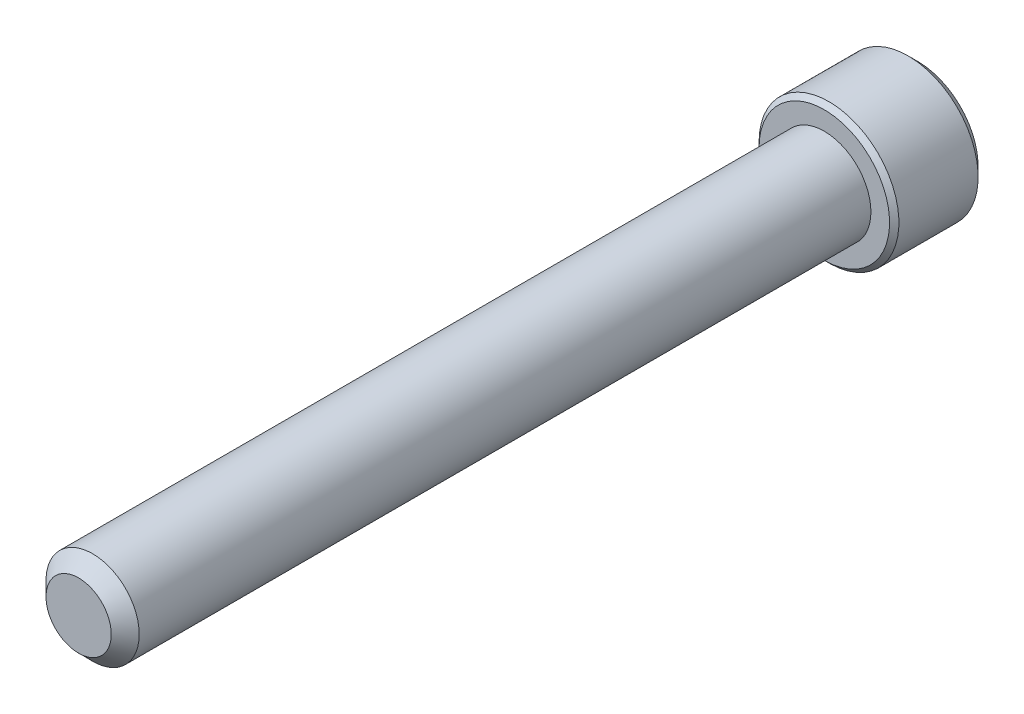
ISO-10303-21;
HEADER;
FILE_DESCRIPTION(('STEP AP214'),'2;1');
FILE_NAME('part.step','',(''),(''),'','','');
FILE_SCHEMA(('AUTOMOTIVE_DESIGN { 1 0 10303 214 1 1 1 1 }'));
ENDSEC;
DATA;
#1=APPLICATION_CONTEXT('core data for automotive mechanical design processes');
#2=APPLICATION_PROTOCOL_DEFINITION('international standard','automotive_design',2000,#1);
#3=PRODUCT_CONTEXT('',#1,'mechanical');
#4=PRODUCT('Part','Part','',(#3));
#5=PRODUCT_RELATED_PRODUCT_CATEGORY('part','',(#4));
#6=PRODUCT_DEFINITION_FORMATION('','',#4);
#7=PRODUCT_DEFINITION_CONTEXT('part definition',#1,'design');
#8=PRODUCT_DEFINITION('design','',#6,#7);
#9=PRODUCT_DEFINITION_SHAPE('','',#8);
#10=(LENGTH_UNIT() NAMED_UNIT(*) SI_UNIT(.MILLI.,.METRE.));
#11=(NAMED_UNIT(*) PLANE_ANGLE_UNIT() SI_UNIT($,.RADIAN.));
#12=(NAMED_UNIT(*) SI_UNIT($,.STERADIAN.) SOLID_ANGLE_UNIT());
#13=UNCERTAINTY_MEASURE_WITH_UNIT(LENGTH_MEASURE(1.E-05),#10,'distance_accuracy_value','');
#14=(GEOMETRIC_REPRESENTATION_CONTEXT(3) GLOBAL_UNCERTAINTY_ASSIGNED_CONTEXT((#13)) GLOBAL_UNIT_ASSIGNED_CONTEXT((#10,
#11,#12)) REPRESENTATION_CONTEXT('',''));
#15=CARTESIAN_POINT('',(0.,0.,0.));
#16=DIRECTION('',(0.,0.,1.));
#17=DIRECTION('',(1.,0.,0.));
#18=AXIS2_PLACEMENT_3D('',#15,#16,#17);
#19=CARTESIAN_POINT('',(0.,0.,-50.8));
#20=DIRECTION('',(0.,0.,1.));
#21=DIRECTION('',(1.,0.,0.));
#22=AXIS2_PLACEMENT_3D('',#19,#20,#21);
#23=CYLINDRICAL_SURFACE('',#22,3.175);
#24=CARTESIAN_POINT('',(0.,0.,-50.8));
#25=DIRECTION('',(0.,0.,-1.));
#26=DIRECTION('',(-1.,0.,0.));
#27=AXIS2_PLACEMENT_3D('',#24,#25,#26);
#28=CIRCLE('',#27,3.175);
#29=CARTESIAN_POINT('',(-3.175,0.,-50.8));
#30=VERTEX_POINT('',#29);
#31=EDGE_CURVE('E210',#30,#30,#28,.F.);
#32=ORIENTED_EDGE('',*,*,#31,.T.);
#33=EDGE_LOOP('',(#32));
#34=FACE_BOUND('',#33,.T.);
#35=CARTESIAN_POINT('',(0.,0.,-0.952499999999995));
#36=DIRECTION('',(0.,0.,1.));
#37=DIRECTION('',(1.,0.,0.));
#38=AXIS2_PLACEMENT_3D('',#35,#36,#37);
#39=CIRCLE('',#38,3.175);
#40=CARTESIAN_POINT('',(3.175,0.,-0.952499999999995));
#41=VERTEX_POINT('',#40);
#42=EDGE_CURVE('E106',#41,#41,#39,.F.);
#43=ORIENTED_EDGE('',*,*,#42,.T.);
#44=EDGE_LOOP('',(#43));
#45=FACE_BOUND('',#44,.T.);
#46=ADVANCED_FACE('F32',(#34,#45),#23,.T.);
#47=CARTESIAN_POINT('',(0.,0.,0.));
#48=DIRECTION('',(0.,0.,1.));
#49=DIRECTION('',(1.,0.,0.));
#50=AXIS2_PLACEMENT_3D('',#47,#48,#49);
#51=PLANE('',#50);
#52=CARTESIAN_POINT('',(0.,0.,0.));
#53=DIRECTION('',(0.,0.,1.));
#54=DIRECTION('',(1.,0.,0.));
#55=AXIS2_PLACEMENT_3D('',#52,#53,#54);
#56=CIRCLE('',#55,2.2225);
#57=CARTESIAN_POINT('',(2.2225,0.,0.));
#58=VERTEX_POINT('',#57);
#59=EDGE_CURVE('E209',#58,#58,#56,.T.);
#60=ORIENTED_EDGE('',*,*,#59,.T.);
#61=EDGE_LOOP('',(#60));
#62=FACE_BOUND('',#61,.T.);
#63=ADVANCED_FACE('F186',(#62),#51,.T.);
#64=CARTESIAN_POINT('',(0.,0.,0.));
#65=DIRECTION('',(0.,0.,-1.));
#66=DIRECTION('',(-1.,0.,0.));
#67=AXIS2_PLACEMENT_3D('',#64,#65,#66);
#68=CONICAL_SURFACE('',#67,2.2225,0.78539816339745);
#69=ORIENTED_EDGE('',*,*,#42,.F.);
#70=EDGE_LOOP('',(#69));
#71=FACE_BOUND('',#70,.T.);
#72=ORIENTED_EDGE('',*,*,#59,.F.);
#73=EDGE_LOOP('',(#72));
#74=FACE_BOUND('',#73,.T.);
#75=ADVANCED_FACE('F192',(#71,#74),#68,.T.);
#76=CARTESIAN_POINT('',(0.,0.,-57.15));
#77=DIRECTION('',(0.,0.,1.));
#78=DIRECTION('',(1.,0.,0.));
#79=AXIS2_PLACEMENT_3D('',#76,#77,#78);
#80=CYLINDRICAL_SURFACE('',#79,4.7625);
#81=CARTESIAN_POINT('',(0.,0.,-51.1175));
#82=DIRECTION('',(0.,0.,-1.));
#83=DIRECTION('',(-1.,0.,0.));
#84=AXIS2_PLACEMENT_3D('',#81,#82,#83);
#85=CIRCLE('',#84,4.7625);
#86=CARTESIAN_POINT('',(-4.7625,0.,-51.1175));
#87=VERTEX_POINT('',#86);
#88=EDGE_CURVE('E40',#87,#87,#85,.T.);
#89=ORIENTED_EDGE('',*,*,#88,.T.);
#90=EDGE_LOOP('',(#89));
#91=FACE_BOUND('',#90,.T.);
#92=CARTESIAN_POINT('',(0.,0.,-56.515));
#93=DIRECTION('',(0.,0.,-1.));
#94=DIRECTION('',(-1.,0.,0.));
#95=AXIS2_PLACEMENT_3D('',#92,#93,#94);
#96=CIRCLE('',#95,4.7625);
#97=CARTESIAN_POINT('',(-4.7625,0.,-56.515));
#98=VERTEX_POINT('',#97);
#99=EDGE_CURVE('E169',#98,#98,#96,.F.);
#100=ORIENTED_EDGE('',*,*,#99,.T.);
#101=EDGE_LOOP('',(#100));
#102=FACE_BOUND('',#101,.T.);
#103=ADVANCED_FACE('F174',(#91,#102),#80,.T.);
#104=CARTESIAN_POINT('',(0.,0.,-57.15));
#105=DIRECTION('',(0.,0.,-1.));
#106=DIRECTION('',(-1.,0.,0.));
#107=AXIS2_PLACEMENT_3D('',#104,#105,#106);
#108=PLANE('',#107);
#109=CARTESIAN_POINT('',(0.,0.,-57.15));
#110=DIRECTION('',(0.,0.,-1.));
#111=DIRECTION('',(-1.,0.,0.));
#112=AXIS2_PLACEMENT_3D('',#109,#110,#111);
#113=CIRCLE('',#112,4.12749999999999);
#114=CARTESIAN_POINT('',(-4.12749999999999,0.,-57.15));
#115=VERTEX_POINT('',#114);
#116=EDGE_CURVE('E105',#115,#115,#113,.T.);
#117=ORIENTED_EDGE('',*,*,#116,.T.);
#118=EDGE_LOOP('',(#117));
#119=FACE_BOUND('',#118,.T.);
#120=CARTESIAN_POINT('',(0.,0.,-57.15));
#121=DIRECTION('',(0.,0.,-1.));
#122=DIRECTION('',(-1.,0.,0.));
#123=AXIS2_PLACEMENT_3D('',#120,#121,#122);
#124=CIRCLE('',#123,2.74963065701559);
#125=CARTESIAN_POINT('',(-2.38125,1.3748153285078,-57.15));
#126=VERTEX_POINT('',#125);
#127=CARTESIAN_POINT('',(0.,2.74963065701559,-57.15));
#128=VERTEX_POINT('',#127);
#129=EDGE_CURVE('E86',#126,#128,#124,.T.);
#130=ORIENTED_EDGE('',*,*,#129,.F.);
#131=CARTESIAN_POINT('',(-2.38125,-1.3748153285078,-57.15));
#132=VERTEX_POINT('',#131);
#133=EDGE_CURVE('E46',#132,#126,#124,.T.);
#134=ORIENTED_EDGE('',*,*,#133,.F.);
#135=CARTESIAN_POINT('',(0.,-2.74963065701559,-57.15));
#136=VERTEX_POINT('',#135);
#137=EDGE_CURVE('E268',#136,#132,#124,.T.);
#138=ORIENTED_EDGE('',*,*,#137,.F.);
#139=CARTESIAN_POINT('',(2.38125,-1.3748153285078,-57.15));
#140=VERTEX_POINT('',#139);
#141=EDGE_CURVE('E53',#140,#136,#124,.T.);
#142=ORIENTED_EDGE('',*,*,#141,.F.);
#143=CARTESIAN_POINT('',(2.38125,1.3748153285078,-57.15));
#144=VERTEX_POINT('',#143);
#145=EDGE_CURVE('E127',#144,#140,#124,.T.);
#146=ORIENTED_EDGE('',*,*,#145,.F.);
#147=EDGE_CURVE('E95',#128,#144,#124,.T.);
#148=ORIENTED_EDGE('',*,*,#147,.F.);
#149=EDGE_LOOP('',(#130,#134,#138,#142,#146,#148));
#150=FACE_BOUND('',#149,.T.);
#151=ADVANCED_FACE('F126',(#119,#150),#108,.T.);
#152=CARTESIAN_POINT('',(0.,0.,-50.8));
#153=DIRECTION('',(0.,0.,-1.));
#154=DIRECTION('',(-1.,0.,0.));
#155=AXIS2_PLACEMENT_3D('',#152,#153,#154);
#156=PLANE('',#155);
#157=CARTESIAN_POINT('',(0.,0.,-50.8));
#158=DIRECTION('',(0.,0.,-1.));
#159=DIRECTION('',(-1.,0.,0.));
#160=AXIS2_PLACEMENT_3D('',#157,#158,#159);
#161=CIRCLE('',#160,4.445);
#162=CARTESIAN_POINT('',(-4.445,0.,-50.8));
#163=VERTEX_POINT('',#162);
#164=EDGE_CURVE('E11',#163,#163,#161,.F.);
#165=ORIENTED_EDGE('',*,*,#164,.T.);
#166=EDGE_LOOP('',(#165));
#167=FACE_BOUND('',#166,.T.);
#168=ORIENTED_EDGE('',*,*,#31,.F.);
#169=EDGE_LOOP('',(#168));
#170=FACE_BOUND('',#169,.T.);
#171=ADVANCED_FACE('F280',(#167,#170),#156,.F.);
#172=CARTESIAN_POINT('',(0.,0.,-57.15));
#173=DIRECTION('',(0.,0.,-1.));
#174=DIRECTION('',(-1.,0.,0.));
#175=AXIS2_PLACEMENT_3D('',#172,#173,#174);
#176=CONICAL_SURFACE('',#175,2.74963065701559,0.78539816339745);
#177=ORIENTED_EDGE('',*,*,#147,.T.);
#178=CARTESIAN_POINT('',(-0.000199999999999782,2.74974612706943,-57.1501154773272));
#179=CARTESIAN_POINT('',(0.0816567823790495,2.70248609172789,-57.1028948967095));
#180=CARTESIAN_POINT('',(0.164882333771759,2.65443579722785,-57.0584475752929));
#181=CARTESIAN_POINT('',(0.334588480838039,2.556455907536,-56.9770654569856));
#182=CARTESIAN_POINT('',(0.421085217353102,2.50651699342501,-56.9401759430951));
#183=CARTESIAN_POINT('',(0.595501774009042,2.40581754748857,-56.8769834131659));
#184=CARTESIAN_POINT('',(0.683377171180673,2.35508266327639,-56.8505215587295));
#185=CARTESIAN_POINT('',(0.861062594070874,2.25249593653966,-56.8097515156161));
#186=CARTESIAN_POINT('',(0.950867191185869,2.20064722822085,-56.7954128915305));
#187=CARTESIAN_POINT('',(1.10563960313034,2.11128933452158,-56.7824757847701));
#188=CARTESIAN_POINT('',(1.17040744896962,2.07389560129144,-56.7805606046532));
#189=CARTESIAN_POINT('',(1.29983727933557,1.99916925388849,-56.7837866227677));
#190=CARTESIAN_POINT('',(1.36449921879335,1.96183666573622,-56.7889302948571));
#191=CARTESIAN_POINT('',(1.49321254857739,1.88752399013711,-56.8059813108716));
#192=CARTESIAN_POINT('',(1.55726317423485,1.85054434417201,-56.8178962213493));
#193=CARTESIAN_POINT('',(1.68425683890527,1.77722451768917,-56.847835672352));
#194=CARTESIAN_POINT('',(1.74719996243582,1.74088428837517,-56.8658597445185));
#195=CARTESIAN_POINT('',(1.90842615073218,1.64780030516185,-56.9193688075524));
#196=CARTESIAN_POINT('',(2.00570949128784,1.59163374230437,-56.9588874208722));
#197=CARTESIAN_POINT('',(2.14875606262557,1.50904576583588,-57.0256003435508));
#198=CARTESIAN_POINT('',(2.19589628894396,1.4818293434813,-57.0490402091113));
#199=CARTESIAN_POINT('',(2.28930352636664,1.42790064981106,-57.0980566766595));
#200=CARTESIAN_POINT('',(2.33557105249682,1.40118808114506,-57.1236319667669));
#201=CARTESIAN_POINT('',(2.38145,1.37469985845396,-57.1501154773272));
#202=B_SPLINE_CURVE_WITH_KNOTS('',3,(#178,#179,#180,#181,#182,#183,#184,#185,#186,#187,#188,
#189,#190,#191,#192,#193,#194,#195,#196,#197,#198,#199,#200,#201),.UNSPECIFIED.,.F.,.F.,(4,2,2,
2,2,2,2,2,2,2,2,4),(0.,0.317196610611948,0.636241461041217,0.950218950629219,1.26340583824126,
1.48752413747844,1.71172100167747,1.93616888974082,2.16059957440836,2.51709639744762,
2.69486147369098,2.87251813383154),.UNSPECIFIED.);
#203=EDGE_CURVE('E100',#128,#144,#202,.T.);
#204=ORIENTED_EDGE('',*,*,#203,.F.);
#205=EDGE_LOOP('',(#177,#204));
#206=FACE_BOUND('',#205,.T.);
#207=ADVANCED_FACE('F101',(#206),#176,.F.);
#208=ORIENTED_EDGE('',*,*,#145,.T.);
#209=CARTESIAN_POINT('',(2.38125,-2.76261914440418,-58.0476170860817));
#210=CARTESIAN_POINT('',(2.38125,-2.69544479536901,-57.9967472146641));
#211=CARTESIAN_POINT('',(2.38125,-2.62789666157822,-57.9463629455589));
#212=CARTESIAN_POINT('',(2.38125,-2.4919044897762,-57.8467837708364));
#213=CARTESIAN_POINT('',(2.38125,-2.42346023321903,-57.7975891640069));
#214=CARTESIAN_POINT('',(2.38125,-2.28502676073673,-57.7002575507657));
#215=CARTESIAN_POINT('',(2.38125,-2.21502968492295,-57.6521316856912));
#216=CARTESIAN_POINT('',(2.38125,-2.0738510354933,-57.5576556101338));
#217=CARTESIAN_POINT('',(2.38125,-2.00266954568685,-57.5113052747739));
#218=CARTESIAN_POINT('',(2.38125,-1.85474026844006,-57.4181368561695));
#219=CARTESIAN_POINT('',(2.38125,-1.77790995637349,-57.3714491376499));
#220=CARTESIAN_POINT('',(2.38125,-1.62247617017446,-57.281129605859));
#221=CARTESIAN_POINT('',(2.38125,-1.54387293128849,-57.2374973902755));
#222=CARTESIAN_POINT('',(2.38125,-1.38486272137713,-57.1542071100282));
#223=CARTESIAN_POINT('',(2.38125,-1.30446163393306,-57.1145379009361));
#224=CARTESIAN_POINT('',(2.38125,-1.14145314547589,-57.0400690459263));
#225=CARTESIAN_POINT('',(2.38125,-1.05884677109142,-57.0052671796135));
#226=CARTESIAN_POINT('',(2.38125,-0.898296083334554,-56.944429813229));
#227=CARTESIAN_POINT('',(2.38125,-0.820539229733751,-56.9179047139327));
#228=CARTESIAN_POINT('',(2.38125,-0.66313538085675,-56.8710898392085));
#229=CARTESIAN_POINT('',(2.38125,-0.583488257498862,-56.8508004876119));
#230=CARTESIAN_POINT('',(2.38125,-0.424114177096844,-56.8178604073913));
#231=CARTESIAN_POINT('',(2.38125,-0.344414987504263,-56.8050775337025));
#232=CARTESIAN_POINT('',(2.38125,-0.184141832361617,-56.7874018129255));
#233=CARTESIAN_POINT('',(2.38125,-0.103568024531891,-56.7825075663141));
#234=CARTESIAN_POINT('',(2.38125,0.0546452704451429,-56.7809814589761));
#235=CARTESIAN_POINT('',(2.38125,0.132281935816136,-56.7840477837949));
#236=CARTESIAN_POINT('',(2.38125,0.286899761817834,-56.7976029014608));
#237=CARTESIAN_POINT('',(2.38125,0.363880858672077,-56.8080924083037));
#238=CARTESIAN_POINT('',(2.38125,0.517934845552119,-56.8360957916784));
#239=CARTESIAN_POINT('',(2.38125,0.594985552514186,-56.8537299282363));
#240=CARTESIAN_POINT('',(2.38125,0.747397784971255,-56.8950790150024));
#241=CARTESIAN_POINT('',(2.38125,0.822759444078558,-56.9187934823661));
#242=CARTESIAN_POINT('',(2.38125,1.05910849740065,-57.0021079749025));
#243=CARTESIAN_POINT('',(2.38125,1.21677702097592,-57.0711581302676));
#244=CARTESIAN_POINT('',(2.38125,1.44750538913538,-57.1862600462423));
#245=CARTESIAN_POINT('',(2.38125,1.52359597394722,-57.2266390556526));
#246=CARTESIAN_POINT('',(2.38125,1.67404919579933,-57.3105045047098));
#247=CARTESIAN_POINT('',(2.38125,1.7484121396892,-57.3539903868604));
#248=CARTESIAN_POINT('',(2.38125,1.89195740305344,-57.441219749271));
#249=CARTESIAN_POINT('',(2.38125,1.96121355997407,-57.4848431031729));
#250=CARTESIAN_POINT('',(2.38125,2.09853826165519,-57.5739297072438));
#251=CARTESIAN_POINT('',(2.38125,2.16660671605602,-57.6193930965356));
#252=CARTESIAN_POINT('',(2.38125,2.30115854912694,-57.7114552844234));
#253=CARTESIAN_POINT('',(2.38125,2.36765030390079,-57.7580418918462));
#254=CARTESIAN_POINT('',(2.38125,2.49972444191924,-57.8524503249111));
#255=CARTESIAN_POINT('',(2.38125,2.5653070703448,-57.9002718071541));
#256=CARTESIAN_POINT('',(2.38125,2.63050906958837,-57.9485984122085));
#257=B_SPLINE_CURVE_WITH_KNOTS('',3,(#209,#210,#211,#212,#213,#214,#215,#216,#217,#218,#219,
#220,#221,#222,#223,#224,#225,#226,#227,#228,#229,#230,#231,#232,#233,#234,#235,#236,#237,#238,
#239,#240,#241,#242,#243,#244,#245,#246,#247,#248,#249,#250,#251,#252,#253,#254,#255,#256),
.UNSPECIFIED.,.F.,.F.,(4,2,2,2,2,2,2,2,2,2,2,2,2,2,2,2,2,2,2,2,2,2,2,4),(0.,0.252791871598821,
0.505646586889963,0.760459562213691,1.01525458294592,1.28490904202319,1.55452792920363,
1.82336591151043,2.09208085189144,2.33833488227844,2.58460564635827,2.82639989379203,
3.06815123972667,3.30087188936523,3.53361492618303,3.77045005614641,4.00726638464204,
4.52203846871501,4.78044014408765,5.03879556784398,5.2843158222589,5.52985467496287,
5.77340315409167,6.01688462048988),.UNSPECIFIED.);
#258=EDGE_CURVE('E94',#144,#140,#257,.F.);
#259=ORIENTED_EDGE('',*,*,#258,.F.);
#260=EDGE_LOOP('',(#208,#259));
#261=FACE_BOUND('',#260,.T.);
#262=ADVANCED_FACE('F274',(#261),#176,.F.);
#263=ORIENTED_EDGE('',*,*,#141,.T.);
#264=CARTESIAN_POINT('',(2.38145,-1.37469985845396,-57.1501154773272));
#265=CARTESIAN_POINT('',(2.29959321762095,-1.4219598937955,-57.1028948967095));
#266=CARTESIAN_POINT('',(2.21636766622824,-1.47001018829554,-57.0584475752929));
#267=CARTESIAN_POINT('',(2.04666151916196,-1.56799007798739,-56.9770654569856));
#268=CARTESIAN_POINT('',(1.9601647826469,-1.61792899209838,-56.9401759430951));
#269=CARTESIAN_POINT('',(1.78574822599096,-1.71862843803482,-56.8769834131659));
#270=CARTESIAN_POINT('',(1.69787282881933,-1.769363322247,-56.8505215587295));
#271=CARTESIAN_POINT('',(1.52018740592913,-1.87195004898373,-56.8097515156161));
#272=CARTESIAN_POINT('',(1.43038280881413,-1.92379875730254,-56.7954128915305));
#273=CARTESIAN_POINT('',(1.27561039686966,-2.01315665100181,-56.7824757847701));
#274=CARTESIAN_POINT('',(1.21084255103038,-2.05055038423195,-56.7805606046532));
#275=CARTESIAN_POINT('',(1.08141272066443,-2.1252767316349,-56.7837866227677));
#276=CARTESIAN_POINT('',(1.01675078120665,-2.16260931978717,-56.7889302948571));
#277=CARTESIAN_POINT('',(0.888037451422605,-2.23692199538628,-56.8059813108716));
#278=CARTESIAN_POINT('',(0.823986825765147,-2.27390164135138,-56.8178962213493));
#279=CARTESIAN_POINT('',(0.696993161094728,-2.34722146783422,-56.847835672352));
#280=CARTESIAN_POINT('',(0.634050037564177,-2.38356169714822,-56.8658597445185));
#281=CARTESIAN_POINT('',(0.47282384926782,-2.47664568036154,-56.9193688075524));
#282=CARTESIAN_POINT('',(0.375540508712161,-2.53281224321902,-56.9588874208722));
#283=CARTESIAN_POINT('',(0.232493937374431,-2.61540021968751,-57.0256003435508));
#284=CARTESIAN_POINT('',(0.185353711056036,-2.64261664204209,-57.0490402091113));
#285=CARTESIAN_POINT('',(0.091946473633363,-2.69654533571233,-57.0980566766595));
#286=CARTESIAN_POINT('',(0.0456789475031799,-2.72325790437833,-57.1236319667669));
#287=CARTESIAN_POINT('',(-0.000199999999999073,-2.74974612706943,-57.1501154773272));
#288=B_SPLINE_CURVE_WITH_KNOTS('',3,(#264,#265,#266,#267,#268,#269,#270,#271,#272,#273,#274,
#275,#276,#277,#278,#279,#280,#281,#282,#283,#284,#285,#286,#287),.UNSPECIFIED.,.F.,.F.,(4,2,2,
2,2,2,2,2,2,2,2,4),(0.,0.317196610611948,0.636241461041217,0.950218950629219,1.26340583824126,
1.48752413747844,1.71172100167747,1.93616888974082,2.16059957440836,2.51709639744763,
2.69486147369099,2.87251813383154),.UNSPECIFIED.);
#289=EDGE_CURVE('E137',#140,#136,#288,.T.);
#290=ORIENTED_EDGE('',*,*,#289,.F.);
#291=EDGE_LOOP('',(#263,#290));
#292=FACE_BOUND('',#291,.T.);
#293=ADVANCED_FACE('F271',(#292),#176,.F.);
#294=ORIENTED_EDGE('',*,*,#137,.T.);
#295=CARTESIAN_POINT('',(0.000200000000000133,-2.74974612706943,-57.1501154773272));
#296=CARTESIAN_POINT('',(-0.0816567823790491,-2.70248609172789,-57.1028948967095));
#297=CARTESIAN_POINT('',(-0.164882333771759,-2.65443579722785,-57.0584475752929));
#298=CARTESIAN_POINT('',(-0.334588480838039,-2.556455907536,-56.9770654569856));
#299=CARTESIAN_POINT('',(-0.421085217353103,-2.50651699342501,-56.9401759430951));
#300=CARTESIAN_POINT('',(-0.595501774009042,-2.40581754748857,-56.8769834131659));
#301=CARTESIAN_POINT('',(-0.683377171180673,-2.35508266327639,-56.8505215587295));
#302=CARTESIAN_POINT('',(-0.861062594070874,-2.25249593653966,-56.8097515156161));
#303=CARTESIAN_POINT('',(-0.950867191185869,-2.20064722822085,-56.7954128915305));
#304=CARTESIAN_POINT('',(-1.10563960313034,-2.11128933452158,-56.7824757847701));
#305=CARTESIAN_POINT('',(-1.17040744896962,-2.07389560129144,-56.7805606046532));
#306=CARTESIAN_POINT('',(-1.29983727933557,-1.99916925388849,-56.7837866227677));
#307=CARTESIAN_POINT('',(-1.36449921879335,-1.96183666573622,-56.7889302948571));
#308=CARTESIAN_POINT('',(-1.49321254857739,-1.88752399013711,-56.8059813108716));
#309=CARTESIAN_POINT('',(-1.55726317423485,-1.85054434417201,-56.8178962213493));
#310=CARTESIAN_POINT('',(-1.68425683890527,-1.77722451768917,-56.847835672352));
#311=CARTESIAN_POINT('',(-1.74719996243582,-1.74088428837517,-56.8658597445185));
#312=CARTESIAN_POINT('',(-1.90842615073218,-1.64780030516185,-56.9193688075524));
#313=CARTESIAN_POINT('',(-2.00570949128784,-1.59163374230437,-56.9588874208722));
#314=CARTESIAN_POINT('',(-2.14875606262557,-1.50904576583588,-57.0256003435508));
#315=CARTESIAN_POINT('',(-2.19589628894396,-1.4818293434813,-57.0490402091113));
#316=CARTESIAN_POINT('',(-2.28930352636664,-1.42790064981106,-57.0980566766595));
#317=CARTESIAN_POINT('',(-2.33557105249682,-1.40118808114506,-57.1236319667669));
#318=CARTESIAN_POINT('',(-2.38145,-1.37469985845396,-57.1501154773272));
#319=B_SPLINE_CURVE_WITH_KNOTS('',3,(#295,#296,#297,#298,#299,#300,#301,#302,#303,#304,#305,
#306,#307,#308,#309,#310,#311,#312,#313,#314,#315,#316,#317,#318),.UNSPECIFIED.,.F.,.F.,(4,2,2,
2,2,2,2,2,2,2,2,4),(0.,0.317196610611948,0.636241461041217,0.95021895062922,1.26340583824126,
1.48752413747844,1.71172100167747,1.93616888974082,2.16059957440836,2.51709639744762,
2.69486147369099,2.87251813383154),.UNSPECIFIED.);
#320=EDGE_CURVE('E245',#136,#132,#319,.T.);
#321=ORIENTED_EDGE('',*,*,#320,.F.);
#322=EDGE_LOOP('',(#294,#321));
#323=FACE_BOUND('',#322,.T.);
#324=ADVANCED_FACE('F270',(#323),#176,.F.);
#325=ORIENTED_EDGE('',*,*,#133,.T.);
#326=CARTESIAN_POINT('',(-2.38125,-2.76261914440419,-58.0476170860817));
#327=CARTESIAN_POINT('',(-2.38125,-2.69544479536901,-57.9967472146641));
#328=CARTESIAN_POINT('',(-2.38125,-2.62789666157823,-57.9463629455589));
#329=CARTESIAN_POINT('',(-2.38125,-2.4919044897762,-57.8467837708364));
#330=CARTESIAN_POINT('',(-2.38125,-2.42346023321903,-57.7975891640069));
#331=CARTESIAN_POINT('',(-2.38125,-2.28502676073673,-57.7002575507657));
#332=CARTESIAN_POINT('',(-2.38125,-2.21502968492295,-57.6521316856912));
#333=CARTESIAN_POINT('',(-2.38125,-2.0738510354933,-57.5576556101338));
#334=CARTESIAN_POINT('',(-2.38125,-2.00266954568685,-57.5113052747739));
#335=CARTESIAN_POINT('',(-2.38125,-1.85474026844006,-57.4181368561695));
#336=CARTESIAN_POINT('',(-2.38125,-1.7779099563735,-57.37144913765));
#337=CARTESIAN_POINT('',(-2.38125,-1.62247617017447,-57.281129605859));
#338=CARTESIAN_POINT('',(-2.38125,-1.5438729312885,-57.2374973902755));
#339=CARTESIAN_POINT('',(-2.38125,-1.38486272137713,-57.1542071100282));
#340=CARTESIAN_POINT('',(-2.38125,-1.30446163393306,-57.1145379009361));
#341=CARTESIAN_POINT('',(-2.38125,-1.14145314547589,-57.0400690459263));
#342=CARTESIAN_POINT('',(-2.38125,-1.05884677109141,-57.0052671796135));
#343=CARTESIAN_POINT('',(-2.38125,-0.898296083334552,-56.944429813229));
#344=CARTESIAN_POINT('',(-2.38125,-0.820539229733751,-56.9179047139327));
#345=CARTESIAN_POINT('',(-2.38125,-0.66313538085675,-56.8710898392085));
#346=CARTESIAN_POINT('',(-2.38125,-0.58348825749886,-56.8508004876119));
#347=CARTESIAN_POINT('',(-2.38125,-0.424114177096841,-56.8178604073913));
#348=CARTESIAN_POINT('',(-2.38125,-0.344414987504261,-56.8050775337025));
#349=CARTESIAN_POINT('',(-2.38125,-0.184141832361616,-56.7874018129255));
#350=CARTESIAN_POINT('',(-2.38125,-0.10356802453189,-56.7825075663141));
#351=CARTESIAN_POINT('',(-2.38125,0.0546452704451434,-56.7809814589761));
#352=CARTESIAN_POINT('',(-2.38125,0.132281935816136,-56.7840477837949));
#353=CARTESIAN_POINT('',(-2.38125,0.286899761817836,-56.7976029014608));
#354=CARTESIAN_POINT('',(-2.38125,0.363880858672078,-56.8080924083037));
#355=CARTESIAN_POINT('',(-2.38125,0.51793484555212,-56.8360957916784));
#356=CARTESIAN_POINT('',(-2.38125,0.594985552514188,-56.8537299282363));
#357=CARTESIAN_POINT('',(-2.38125,0.747397784971256,-56.8950790150024));
#358=CARTESIAN_POINT('',(-2.38125,0.822759444078558,-56.9187934823661));
#359=CARTESIAN_POINT('',(-2.38125,1.05910849740065,-57.0021079749025));
#360=CARTESIAN_POINT('',(-2.38125,1.21677702097592,-57.0711581302676));
#361=CARTESIAN_POINT('',(-2.38125,1.44750538913538,-57.1862600462423));
#362=CARTESIAN_POINT('',(-2.38125,1.52359597394722,-57.2266390556526));
#363=CARTESIAN_POINT('',(-2.38125,1.67404919579933,-57.3105045047098));
#364=CARTESIAN_POINT('',(-2.38125,1.7484121396892,-57.3539903868604));
#365=CARTESIAN_POINT('',(-2.38125,1.89195740305344,-57.441219749271));
#366=CARTESIAN_POINT('',(-2.38125,1.96121355997407,-57.4848431031729));
#367=CARTESIAN_POINT('',(-2.38125,2.09853826165519,-57.5739297072438));
#368=CARTESIAN_POINT('',(-2.38125,2.16660671605602,-57.6193930965356));
#369=CARTESIAN_POINT('',(-2.38125,2.30115854912694,-57.7114552844234));
#370=CARTESIAN_POINT('',(-2.38125,2.36765030390079,-57.7580418918462));
#371=CARTESIAN_POINT('',(-2.38125,2.49972444191924,-57.8524503249111));
#372=CARTESIAN_POINT('',(-2.38125,2.5653070703448,-57.9002718071541));
#373=CARTESIAN_POINT('',(-2.38125,2.63050906958837,-57.9485984122085));
#374=B_SPLINE_CURVE_WITH_KNOTS('',3,(#326,#327,#328,#329,#330,#331,#332,#333,#334,#335,#336,
#337,#338,#339,#340,#341,#342,#343,#344,#345,#346,#347,#348,#349,#350,#351,#352,#353,#354,#355,
#356,#357,#358,#359,#360,#361,#362,#363,#364,#365,#366,#367,#368,#369,#370,#371,#372,#373),
.UNSPECIFIED.,.F.,.F.,(4,2,2,2,2,2,2,2,2,2,2,2,2,2,2,2,2,2,2,2,2,2,2,4),(0.,0.252791871598824,
0.505646586889965,0.760459562213694,1.01525458294592,1.28490904202319,1.55452792920362,
1.82336591151044,2.09208085189145,2.33833488227845,2.58460564635827,2.82639989379204,
3.06815123972667,3.30087188936523,3.53361492618304,3.77045005614642,4.00726638464204,
4.52203846871501,4.78044014408765,5.03879556784399,5.28431582225891,5.52985467496287,
5.77340315409167,6.01688462048988),.UNSPECIFIED.);
#375=EDGE_CURVE('E116',#132,#126,#374,.T.);
#376=ORIENTED_EDGE('',*,*,#375,.F.);
#377=EDGE_LOOP('',(#325,#376));
#378=FACE_BOUND('',#377,.T.);
#379=ADVANCED_FACE('F287',(#378),#176,.F.);
#380=ORIENTED_EDGE('',*,*,#129,.T.);
#381=CARTESIAN_POINT('',(-2.38145,1.37469985845396,-57.1501154773272));
#382=CARTESIAN_POINT('',(-2.29959321762095,1.4219598937955,-57.1028948967095));
#383=CARTESIAN_POINT('',(-2.21636766622824,1.47001018829554,-57.0584475752929));
#384=CARTESIAN_POINT('',(-2.04666151916196,1.56799007798739,-56.9770654569856));
#385=CARTESIAN_POINT('',(-1.9601647826469,1.61792899209838,-56.9401759430951));
#386=CARTESIAN_POINT('',(-1.78574822599096,1.71862843803482,-56.8769834131659));
#387=CARTESIAN_POINT('',(-1.69787282881933,1.769363322247,-56.8505215587295));
#388=CARTESIAN_POINT('',(-1.52018740592913,1.87195004898373,-56.8097515156161));
#389=CARTESIAN_POINT('',(-1.43038280881413,1.92379875730254,-56.7954128915305));
#390=CARTESIAN_POINT('',(-1.27561039686966,2.01315665100181,-56.7824757847701));
#391=CARTESIAN_POINT('',(-1.21084255103039,2.05055038423195,-56.7805606046532));
#392=CARTESIAN_POINT('',(-1.08141272066443,2.1252767316349,-56.7837866227677));
#393=CARTESIAN_POINT('',(-1.01675078120665,2.16260931978717,-56.7889302948571));
#394=CARTESIAN_POINT('',(-0.888037451422606,2.23692199538628,-56.8059813108716));
#395=CARTESIAN_POINT('',(-0.823986825765148,2.27390164135138,-56.8178962213493));
#396=CARTESIAN_POINT('',(-0.69699316109473,2.34722146783422,-56.847835672352));
#397=CARTESIAN_POINT('',(-0.634050037564179,2.38356169714822,-56.8658597445185));
#398=CARTESIAN_POINT('',(-0.472823849267821,2.47664568036154,-56.9193688075524));
#399=CARTESIAN_POINT('',(-0.375540508712162,2.53281224321902,-56.9588874208722));
#400=CARTESIAN_POINT('',(-0.23249393737443,2.61540021968751,-57.0256003435508));
#401=CARTESIAN_POINT('',(-0.185353711056035,2.6426166420421,-57.0490402091113));
#402=CARTESIAN_POINT('',(-0.0919464736333611,2.69654533571234,-57.0980566766595));
#403=CARTESIAN_POINT('',(-0.0456789475031786,2.72325790437833,-57.1236319667669));
#404=CARTESIAN_POINT('',(0.000199999999999554,2.74974612706943,-57.1501154773272));
#405=B_SPLINE_CURVE_WITH_KNOTS('',3,(#381,#382,#383,#384,#385,#386,#387,#388,#389,#390,#391,
#392,#393,#394,#395,#396,#397,#398,#399,#400,#401,#402,#403,#404),.UNSPECIFIED.,.F.,.F.,(4,2,2,
2,2,2,2,2,2,2,2,4),(0.,0.317196610611948,0.636241461041217,0.950218950629219,1.26340583824126,
1.48752413747844,1.71172100167747,1.93616888974082,2.16059957440836,2.51709639744763,
2.69486147369099,2.87251813383154),.UNSPECIFIED.);
#406=EDGE_CURVE('E90',#126,#128,#405,.T.);
#407=ORIENTED_EDGE('',*,*,#406,.F.);
#408=EDGE_LOOP('',(#380,#407));
#409=FACE_BOUND('',#408,.T.);
#410=ADVANCED_FACE('F88',(#409),#176,.F.);
#411=CARTESIAN_POINT('',(2.38125,4.12444598552339,-53.578125));
#412=DIRECTION('',(0.,0.,-1.));
#413=DIRECTION('',(-1.,0.,0.));
#414=AXIS2_PLACEMENT_3D('',#411,#412,#413);
#415=PLANE('',#414);
#416=DIRECTION('',(0.866025403784439,0.5,0.));
#417=VECTOR('',#416,1.);
#418=CARTESIAN_POINT('',(-2.38125,1.3748153285078,-53.578125));
#419=LINE('',#418,#417);
#420=CARTESIAN_POINT('',(-2.38125,1.3748153285078,-53.578125));
#421=VERTEX_POINT('',#420);
#422=CARTESIAN_POINT('',(0.,2.74963065701559,-53.578125));
#423=VERTEX_POINT('',#422);
#424=EDGE_CURVE('E115',#421,#423,#419,.T.);
#425=ORIENTED_EDGE('',*,*,#424,.T.);
#426=DIRECTION('',(0.866025403784439,-0.5,0.));
#427=VECTOR('',#426,1.);
#428=CARTESIAN_POINT('',(0.,2.74963065701559,-53.578125));
#429=LINE('',#428,#427);
#430=CARTESIAN_POINT('',(2.38125,1.3748153285078,-53.578125));
#431=VERTEX_POINT('',#430);
#432=EDGE_CURVE('E120',#423,#431,#429,.T.);
#433=ORIENTED_EDGE('',*,*,#432,.T.);
#434=DIRECTION('',(0.,-1.,0.));
#435=VECTOR('',#434,1.);
#436=CARTESIAN_POINT('',(2.38125,1.3748153285078,-53.578125));
#437=LINE('',#436,#435);
#438=CARTESIAN_POINT('',(2.38125,-1.3748153285078,-53.578125));
#439=VERTEX_POINT('',#438);
#440=EDGE_CURVE('E231',#431,#439,#437,.T.);
#441=ORIENTED_EDGE('',*,*,#440,.T.);
#442=DIRECTION('',(-0.866025403784439,-0.5,0.));
#443=VECTOR('',#442,1.);
#444=CARTESIAN_POINT('',(2.38125,-1.3748153285078,-53.578125));
#445=LINE('',#444,#443);
#446=CARTESIAN_POINT('',(0.,-2.74963065701559,-53.578125));
#447=VERTEX_POINT('',#446);
#448=EDGE_CURVE('E228',#439,#447,#445,.T.);
#449=ORIENTED_EDGE('',*,*,#448,.T.);
#450=DIRECTION('',(-0.866025403784439,0.5,0.));
#451=VECTOR('',#450,1.);
#452=CARTESIAN_POINT('',(0.,-2.74963065701559,-53.578125));
#453=LINE('',#452,#451);
#454=CARTESIAN_POINT('',(-2.38125,-1.3748153285078,-53.578125));
#455=VERTEX_POINT('',#454);
#456=EDGE_CURVE('E225',#447,#455,#453,.T.);
#457=ORIENTED_EDGE('',*,*,#456,.T.);
#458=DIRECTION('',(0.,1.,0.));
#459=VECTOR('',#458,1.);
#460=CARTESIAN_POINT('',(-2.38125,-1.3748153285078,-53.578125));
#461=LINE('',#460,#459);
#462=EDGE_CURVE('E123',#455,#421,#461,.T.);
#463=ORIENTED_EDGE('',*,*,#462,.T.);
#464=EDGE_LOOP('',(#425,#433,#441,#449,#457,#463));
#465=FACE_BOUND('',#464,.T.);
#466=ADVANCED_FACE('F157',(#465),#415,.T.);
#467=CARTESIAN_POINT('',(0.,2.74963065701559,-53.578125));
#468=DIRECTION('',(0.5,0.866025403784439,0.));
#469=DIRECTION('',(-0.866025403784439,0.5,0.));
#470=AXIS2_PLACEMENT_3D('',#467,#468,#469);
#471=PLANE('',#470);
#472=DIRECTION('',(0.,0.,-1.));
#473=VECTOR('',#472,1.);
#474=CARTESIAN_POINT('',(0.,2.74963065701559,-53.578125));
#475=LINE('',#474,#473);
#476=EDGE_CURVE('E112',#423,#128,#475,.T.);
#477=ORIENTED_EDGE('',*,*,#476,.T.);
#478=ORIENTED_EDGE('',*,*,#203,.T.);
#479=DIRECTION('',(0.,0.,-1.));
#480=VECTOR('',#479,1.);
#481=CARTESIAN_POINT('',(2.38125,1.3748153285078,-53.578125));
#482=LINE('',#481,#480);
#483=EDGE_CURVE('E122',#431,#144,#482,.T.);
#484=ORIENTED_EDGE('',*,*,#483,.F.);
#485=ORIENTED_EDGE('',*,*,#432,.F.);
#486=EDGE_LOOP('',(#477,#478,#484,#485));
#487=FACE_BOUND('',#486,.T.);
#488=ADVANCED_FACE('F118',(#487),#471,.F.);
#489=CARTESIAN_POINT('',(2.38125,1.3748153285078,-53.578125));
#490=DIRECTION('',(1.,0.,0.));
#491=DIRECTION('',(0.,1.,0.));
#492=AXIS2_PLACEMENT_3D('',#489,#490,#491);
#493=PLANE('',#492);
#494=ORIENTED_EDGE('',*,*,#483,.T.);
#495=ORIENTED_EDGE('',*,*,#258,.T.);
#496=DIRECTION('',(0.,0.,-1.));
#497=VECTOR('',#496,1.);
#498=CARTESIAN_POINT('',(2.38125,-1.3748153285078,-53.578125));
#499=LINE('',#498,#497);
#500=EDGE_CURVE('E214',#439,#140,#499,.T.);
#501=ORIENTED_EDGE('',*,*,#500,.F.);
#502=ORIENTED_EDGE('',*,*,#440,.F.);
#503=EDGE_LOOP('',(#494,#495,#501,#502));
#504=FACE_BOUND('',#503,.T.);
#505=ADVANCED_FACE('F146',(#504),#493,.F.);
#506=CARTESIAN_POINT('',(2.38125,-1.3748153285078,-53.578125));
#507=DIRECTION('',(0.5,-0.866025403784439,0.));
#508=DIRECTION('',(0.866025403784439,0.5,0.));
#509=AXIS2_PLACEMENT_3D('',#506,#507,#508);
#510=PLANE('',#509);
#511=ORIENTED_EDGE('',*,*,#500,.T.);
#512=ORIENTED_EDGE('',*,*,#289,.T.);
#513=DIRECTION('',(0.,0.,-1.));
#514=VECTOR('',#513,1.);
#515=CARTESIAN_POINT('',(0.,-2.74963065701559,-53.578125));
#516=LINE('',#515,#514);
#517=EDGE_CURVE('E217',#447,#136,#516,.T.);
#518=ORIENTED_EDGE('',*,*,#517,.F.);
#519=ORIENTED_EDGE('',*,*,#448,.F.);
#520=EDGE_LOOP('',(#511,#512,#518,#519));
#521=FACE_BOUND('',#520,.T.);
#522=ADVANCED_FACE('F150',(#521),#510,.F.);
#523=CARTESIAN_POINT('',(0.,-2.74963065701559,-53.578125));
#524=DIRECTION('',(-0.5,-0.866025403784439,0.));
#525=DIRECTION('',(0.866025403784439,-0.5,0.));
#526=AXIS2_PLACEMENT_3D('',#523,#524,#525);
#527=PLANE('',#526);
#528=ORIENTED_EDGE('',*,*,#517,.T.);
#529=ORIENTED_EDGE('',*,*,#320,.T.);
#530=DIRECTION('',(0.,0.,-1.));
#531=VECTOR('',#530,1.);
#532=CARTESIAN_POINT('',(-2.38125,-1.3748153285078,-53.578125));
#533=LINE('',#532,#531);
#534=EDGE_CURVE('E220',#455,#132,#533,.T.);
#535=ORIENTED_EDGE('',*,*,#534,.F.);
#536=ORIENTED_EDGE('',*,*,#456,.F.);
#537=EDGE_LOOP('',(#528,#529,#535,#536));
#538=FACE_BOUND('',#537,.T.);
#539=ADVANCED_FACE('F253',(#538),#527,.F.);
#540=CARTESIAN_POINT('',(-2.38125,-1.3748153285078,-53.578125));
#541=DIRECTION('',(-1.,0.,0.));
#542=DIRECTION('',(0.,-1.,0.));
#543=AXIS2_PLACEMENT_3D('',#540,#541,#542);
#544=PLANE('',#543);
#545=ORIENTED_EDGE('',*,*,#534,.T.);
#546=ORIENTED_EDGE('',*,*,#375,.T.);
#547=DIRECTION('',(0.,0.,-1.));
#548=VECTOR('',#547,1.);
#549=CARTESIAN_POINT('',(-2.38125,1.3748153285078,-53.578125));
#550=LINE('',#549,#548);
#551=EDGE_CURVE('E114',#421,#126,#550,.T.);
#552=ORIENTED_EDGE('',*,*,#551,.F.);
#553=ORIENTED_EDGE('',*,*,#462,.F.);
#554=EDGE_LOOP('',(#545,#546,#552,#553));
#555=FACE_BOUND('',#554,.T.);
#556=ADVANCED_FACE('F250',(#555),#544,.F.);
#557=CARTESIAN_POINT('',(-2.38125,1.3748153285078,-53.578125));
#558=DIRECTION('',(-0.5,0.866025403784439,0.));
#559=DIRECTION('',(-0.866025403784439,-0.5,0.));
#560=AXIS2_PLACEMENT_3D('',#557,#558,#559);
#561=PLANE('',#560);
#562=ORIENTED_EDGE('',*,*,#551,.T.);
#563=ORIENTED_EDGE('',*,*,#406,.T.);
#564=ORIENTED_EDGE('',*,*,#476,.F.);
#565=ORIENTED_EDGE('',*,*,#424,.F.);
#566=EDGE_LOOP('',(#562,#563,#564,#565));
#567=FACE_BOUND('',#566,.T.);
#568=ADVANCED_FACE('F110',(#567),#561,.F.);
#569=CARTESIAN_POINT('',(0.,0.,-57.15));
#570=DIRECTION('',(0.,0.,1.));
#571=DIRECTION('',(1.,0.,0.));
#572=AXIS2_PLACEMENT_3D('',#569,#570,#571);
#573=CONICAL_SURFACE('',#572,4.12749999999999,0.785398163397441);
#574=ORIENTED_EDGE('',*,*,#99,.F.);
#575=EDGE_LOOP('',(#574));
#576=FACE_BOUND('',#575,.T.);
#577=ORIENTED_EDGE('',*,*,#116,.F.);
#578=EDGE_LOOP('',(#577));
#579=FACE_BOUND('',#578,.T.);
#580=ADVANCED_FACE('F178',(#576,#579),#573,.T.);
#581=CARTESIAN_POINT('',(0.,0.,-51.1175));
#582=DIRECTION('',(0.,0.,-1.));
#583=DIRECTION('',(-1.,0.,0.));
#584=AXIS2_PLACEMENT_3D('',#581,#582,#583);
#585=CONICAL_SURFACE('',#584,4.7625,0.785398163397455);
#586=ORIENTED_EDGE('',*,*,#164,.F.);
#587=EDGE_LOOP('',(#586));
#588=FACE_BOUND('',#587,.T.);
#589=ORIENTED_EDGE('',*,*,#88,.F.);
#590=EDGE_LOOP('',(#589));
#591=FACE_BOUND('',#590,.T.);
#592=ADVANCED_FACE('F34',(#588,#591),#585,.T.);
#593=CLOSED_SHELL('',(#46,#63,#75,#103,#151,#171,#207,#262,#293,#324,#379,#410,#466,#488,#505,
#522,#539,#556,#568,#580,#592));
#594=MANIFOLD_SOLID_BREP('B2',#593);
#595=ADVANCED_BREP_SHAPE_REPRESENTATION('',(#18,#594),#14);
#596=SHAPE_DEFINITION_REPRESENTATION(#9,#595);
ENDSEC;
END-ISO-10303-21;
